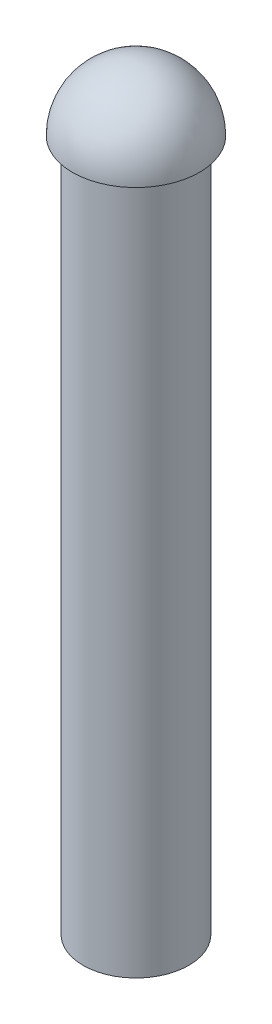
ISO-10303-21;
HEADER;
FILE_DESCRIPTION(('STEP AP214'),'2;1');
FILE_NAME('part.step','',(''),(''),'','','');
FILE_SCHEMA(('AUTOMOTIVE_DESIGN { 1 0 10303 214 1 1 1 1 }'));
ENDSEC;
DATA;
#1=APPLICATION_CONTEXT('core data for automotive mechanical design processes');
#2=APPLICATION_PROTOCOL_DEFINITION('international standard','automotive_design',2000,#1);
#3=PRODUCT_CONTEXT('',#1,'mechanical');
#4=PRODUCT('Part','Part','',(#3));
#5=PRODUCT_RELATED_PRODUCT_CATEGORY('part','',(#4));
#6=PRODUCT_DEFINITION_FORMATION('','',#4);
#7=PRODUCT_DEFINITION_CONTEXT('part definition',#1,'design');
#8=PRODUCT_DEFINITION('design','',#6,#7);
#9=PRODUCT_DEFINITION_SHAPE('','',#8);
#10=(LENGTH_UNIT() NAMED_UNIT(*) SI_UNIT(.MILLI.,.METRE.));
#11=(NAMED_UNIT(*) PLANE_ANGLE_UNIT() SI_UNIT($,.RADIAN.));
#12=(NAMED_UNIT(*) SI_UNIT($,.STERADIAN.) SOLID_ANGLE_UNIT());
#13=UNCERTAINTY_MEASURE_WITH_UNIT(LENGTH_MEASURE(1.E-05),#10,'distance_accuracy_value','');
#14=(GEOMETRIC_REPRESENTATION_CONTEXT(3) GLOBAL_UNCERTAINTY_ASSIGNED_CONTEXT((#13)) GLOBAL_UNIT_ASSIGNED_CONTEXT((#10,
#11,#12)) REPRESENTATION_CONTEXT('',''));
#15=CARTESIAN_POINT('',(0.,0.,0.));
#16=DIRECTION('',(0.,0.,1.));
#17=DIRECTION('',(1.,0.,0.));
#18=AXIS2_PLACEMENT_3D('',#15,#16,#17);
#19=CARTESIAN_POINT('',(0.,0.,0.));
#20=DIRECTION('',(0.,0.,-1.));
#21=DIRECTION('',(-1.,0.,0.));
#22=AXIS2_PLACEMENT_3D('',#19,#20,#21);
#23=SPHERICAL_SURFACE('',#22,7.8);
#24=CARTESIAN_POINT('',(0.,0.,0.));
#25=DIRECTION('',(0.,-1.,0.));
#26=DIRECTION('',(0.,0.,1.));
#27=AXIS2_PLACEMENT_3D('',#24,#25,#26);
#28=SPHERICAL_SURFACE('',#27,7.8);
#29=CARTESIAN_POINT('',(0.,0.,0.));
#30=DIRECTION('',(0.,-1.,0.));
#31=DIRECTION('',(0.,0.,1.));
#32=AXIS2_PLACEMENT_3D('',#29,#30,#31);
#33=CIRCLE('',#32,7.8);
#34=CARTESIAN_POINT('',(0.,0.,7.8));
#35=VERTEX_POINT('',#34);
#36=EDGE_CURVE('E10',#35,#35,#33,.T.);
#37=ORIENTED_EDGE('',*,*,#36,.F.);
#38=EDGE_LOOP('',(#37));
#39=FACE_BOUND('',#38,.T.);
#40=ADVANCED_FACE('F43',(#39),#28,.T.);
#41=CARTESIAN_POINT('',(0.,0.,0.));
#42=DIRECTION('',(0.,-1.,0.));
#43=DIRECTION('',(0.,0.,1.));
#44=AXIS2_PLACEMENT_3D('',#41,#42,#43);
#45=PLANE('',#44);
#46=CARTESIAN_POINT('',(0.,0.,0.));
#47=DIRECTION('',(0.,1.,0.));
#48=DIRECTION('',(0.,0.,1.));
#49=AXIS2_PLACEMENT_3D('',#46,#47,#48);
#50=CIRCLE('',#49,6.5);
#51=CARTESIAN_POINT('',(0.,0.,6.5));
#52=VERTEX_POINT('',#51);
#53=EDGE_CURVE('E55',#52,#52,#50,.T.);
#54=ORIENTED_EDGE('',*,*,#53,.T.);
#55=EDGE_LOOP('',(#54));
#56=FACE_BOUND('',#55,.T.);
#57=ORIENTED_EDGE('',*,*,#36,.T.);
#58=EDGE_LOOP('',(#57));
#59=FACE_BOUND('',#58,.T.);
#60=ADVANCED_FACE('F63',(#56,#59),#45,.T.);
#61=CARTESIAN_POINT('',(0.,-85.,0.));
#62=DIRECTION('',(0.,1.,0.));
#63=DIRECTION('',(0.,0.,1.));
#64=AXIS2_PLACEMENT_3D('',#61,#62,#63);
#65=PLANE('',#64);
#66=CARTESIAN_POINT('',(0.,-85.,0.));
#67=DIRECTION('',(0.,1.,0.));
#68=DIRECTION('',(0.,0.,1.));
#69=AXIS2_PLACEMENT_3D('',#66,#67,#68);
#70=CIRCLE('',#69,6.5);
#71=CARTESIAN_POINT('',(0.,-85.,6.49999999999997));
#72=VERTEX_POINT('',#71);
#73=EDGE_CURVE('E50',#72,#72,#70,.T.);
#74=ORIENTED_EDGE('',*,*,#73,.F.);
#75=EDGE_LOOP('',(#74));
#76=FACE_BOUND('',#75,.T.);
#77=ADVANCED_FACE('F67',(#76),#65,.F.);
#78=CARTESIAN_POINT('',(0.,0.,0.));
#79=DIRECTION('',(0.,1.,0.));
#80=DIRECTION('',(0.,0.,1.));
#81=AXIS2_PLACEMENT_3D('',#78,#79,#80);
#82=CYLINDRICAL_SURFACE('',#81,6.5);
#83=ORIENTED_EDGE('',*,*,#53,.F.);
#84=EDGE_LOOP('',(#83));
#85=FACE_BOUND('',#84,.T.);
#86=ORIENTED_EDGE('',*,*,#73,.T.);
#87=EDGE_LOOP('',(#86));
#88=FACE_BOUND('',#87,.T.);
#89=ADVANCED_FACE('F65',(#85,#88),#82,.T.);
#90=CLOSED_SHELL('',(#40,#60,#77,#89));
#91=MANIFOLD_SOLID_BREP('B2',#90);
#92=ADVANCED_BREP_SHAPE_REPRESENTATION('',(#18,#91),#14);
#93=SHAPE_DEFINITION_REPRESENTATION(#9,#92);
ENDSEC;
END-ISO-10303-21;
